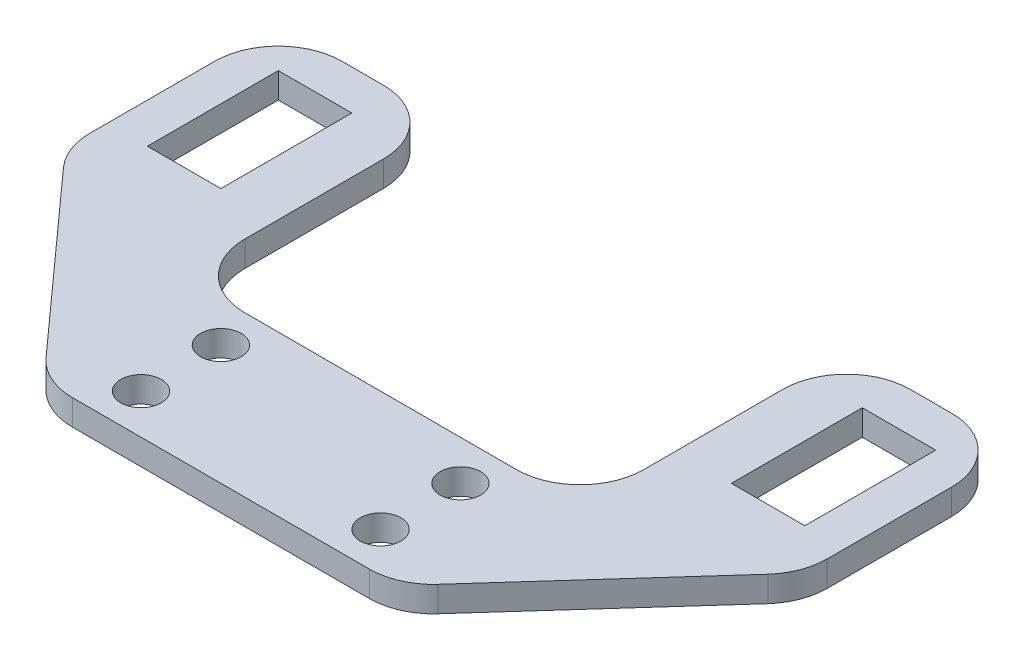
ISO-10303-21;
HEADER;
FILE_DESCRIPTION(('STEP AP214'),'2;1');
FILE_NAME('part.step','',(''),(''),'','','');
FILE_SCHEMA(('AUTOMOTIVE_DESIGN { 1 0 10303 214 1 1 1 1 }'));
ENDSEC;
DATA;
#1=APPLICATION_CONTEXT('core data for automotive mechanical design processes');
#2=APPLICATION_PROTOCOL_DEFINITION('international standard','automotive_design',2000,#1);
#3=PRODUCT_CONTEXT('',#1,'mechanical');
#4=PRODUCT('Part','Part','',(#3));
#5=PRODUCT_RELATED_PRODUCT_CATEGORY('part','',(#4));
#6=PRODUCT_DEFINITION_FORMATION('','',#4);
#7=PRODUCT_DEFINITION_CONTEXT('part definition',#1,'design');
#8=PRODUCT_DEFINITION('design','',#6,#7);
#9=PRODUCT_DEFINITION_SHAPE('','',#8);
#10=(LENGTH_UNIT() NAMED_UNIT(*) SI_UNIT(.MILLI.,.METRE.));
#11=(NAMED_UNIT(*) PLANE_ANGLE_UNIT() SI_UNIT($,.RADIAN.));
#12=(NAMED_UNIT(*) SI_UNIT($,.STERADIAN.) SOLID_ANGLE_UNIT());
#13=UNCERTAINTY_MEASURE_WITH_UNIT(LENGTH_MEASURE(1.E-05),#10,'distance_accuracy_value','');
#14=(GEOMETRIC_REPRESENTATION_CONTEXT(3) GLOBAL_UNCERTAINTY_ASSIGNED_CONTEXT((#13)) GLOBAL_UNIT_ASSIGNED_CONTEXT((#10,
#11,#12)) REPRESENTATION_CONTEXT('',''));
#15=CARTESIAN_POINT('',(0.,0.,0.));
#16=DIRECTION('',(0.,0.,1.));
#17=DIRECTION('',(1.,0.,0.));
#18=AXIS2_PLACEMENT_3D('',#15,#16,#17);
#19=CARTESIAN_POINT('',(0.,2.032,-33.8903073452829));
#20=DIRECTION('',(0.,0.,1.));
#21=DIRECTION('',(1.,0.,0.));
#22=AXIS2_PLACEMENT_3D('',#19,#20,#21);
#23=PLANE('',#22);
#24=DIRECTION('',(-1.,0.,0.));
#25=VECTOR('',#24,1.);
#26=CARTESIAN_POINT('',(0.,2.032,-33.8903073452829));
#27=LINE('',#26,#25);
#28=CARTESIAN_POINT('',(53.556614690566,2.032,-33.8903073452829));
#29=VERTEX_POINT('',#28);
#30=CARTESIAN_POINT('',(50.273307345283,2.032,-33.8903073452829));
#31=VERTEX_POINT('',#30);
#32=EDGE_CURVE('E331',#29,#31,#27,.T.);
#33=ORIENTED_EDGE('',*,*,#32,.F.);
#34=DIRECTION('',(0.,-1.,0.));
#35=VECTOR('',#34,1.);
#36=CARTESIAN_POINT('',(53.556614690566,2.032,-33.8903073452829));
#37=LINE('',#36,#35);
#38=CARTESIAN_POINT('',(53.556614690566,0.,-33.8903073452829));
#39=VERTEX_POINT('',#38);
#40=EDGE_CURVE('E404',#29,#39,#37,.T.);
#41=ORIENTED_EDGE('',*,*,#40,.T.);
#42=DIRECTION('',(-1.,0.,0.));
#43=VECTOR('',#42,1.);
#44=CARTESIAN_POINT('',(0.,0.,-33.8903073452829));
#45=LINE('',#44,#43);
#46=CARTESIAN_POINT('',(50.273307345283,0.,-33.8903073452829));
#47=VERTEX_POINT('',#46);
#48=EDGE_CURVE('E322',#39,#47,#45,.T.);
#49=ORIENTED_EDGE('',*,*,#48,.T.);
#50=DIRECTION('',(0.,1.,0.));
#51=VECTOR('',#50,1.);
#52=CARTESIAN_POINT('',(50.273307345283,2.032,-33.8903073452829));
#53=LINE('',#52,#51);
#54=EDGE_CURVE('E401',#47,#31,#53,.T.);
#55=ORIENTED_EDGE('',*,*,#54,.T.);
#56=EDGE_LOOP('',(#33,#41,#49,#55));
#57=FACE_BOUND('',#56,.T.);
#58=ADVANCED_FACE('F33',(#57),#23,.F.);
#59=CARTESIAN_POINT('',(0.,2.032,0.));
#60=DIRECTION('',(0.,-1.,0.));
#61=DIRECTION('',(0.,0.,-1.));
#62=AXIS2_PLACEMENT_3D('',#59,#60,#61);
#63=PLANE('',#62);
#64=CARTESIAN_POINT('',(38.843307345283,2.032,-9.525));
#65=DIRECTION('',(0.,1.,0.));
#66=DIRECTION('',(0.,0.,-1.));
#67=AXIS2_PLACEMENT_3D('',#64,#65,#66);
#68=CIRCLE('',#67,1.6129);
#69=CARTESIAN_POINT('',(38.843307345283,2.032,-11.1379));
#70=VERTEX_POINT('',#69);
#71=EDGE_CURVE('E263',#70,#70,#68,.T.);
#72=ORIENTED_EDGE('',*,*,#71,.F.);
#73=EDGE_LOOP('',(#72));
#74=FACE_BOUND('',#73,.T.);
#75=CARTESIAN_POINT('',(38.843307345283,2.032,-3.175));
#76=DIRECTION('',(0.,1.,0.));
#77=DIRECTION('',(0.,0.,-1.));
#78=AXIS2_PLACEMENT_3D('',#75,#76,#77);
#79=CIRCLE('',#78,1.6129);
#80=CARTESIAN_POINT('',(38.843307345283,2.032,-4.7879));
#81=VERTEX_POINT('',#80);
#82=EDGE_CURVE('E269',#81,#81,#79,.T.);
#83=ORIENTED_EDGE('',*,*,#82,.F.);
#84=EDGE_LOOP('',(#83));
#85=FACE_BOUND('',#84,.T.);
#86=CARTESIAN_POINT('',(19.793307345283,2.032,-3.175));
#87=DIRECTION('',(0.,1.,0.));
#88=DIRECTION('',(0.,0.,1.));
#89=AXIS2_PLACEMENT_3D('',#86,#87,#88);
#90=CIRCLE('',#89,1.6129);
#91=CARTESIAN_POINT('',(19.793307345283,2.032,-1.5621));
#92=VERTEX_POINT('',#91);
#93=EDGE_CURVE('E275',#92,#92,#90,.T.);
#94=ORIENTED_EDGE('',*,*,#93,.F.);
#95=EDGE_LOOP('',(#94));
#96=FACE_BOUND('',#95,.T.);
#97=CARTESIAN_POINT('',(19.793307345283,2.032,-9.525));
#98=DIRECTION('',(0.,1.,0.));
#99=DIRECTION('',(0.,0.,1.));
#100=AXIS2_PLACEMENT_3D('',#97,#98,#99);
#101=CIRCLE('',#100,1.6129);
#102=CARTESIAN_POINT('',(19.793307345283,2.032,-7.9121));
#103=VERTEX_POINT('',#102);
#104=EDGE_CURVE('E281',#103,#103,#101,.T.);
#105=ORIENTED_EDGE('',*,*,#104,.F.);
#106=EDGE_LOOP('',(#105));
#107=FACE_BOUND('',#106,.T.);
#108=DIRECTION('',(0.,0.,1.));
#109=VECTOR('',#108,1.);
#110=CARTESIAN_POINT('',(3.17499999999999,2.032,-30.715307345283));
#111=LINE('',#110,#109);
#112=CARTESIAN_POINT('',(3.17499999999999,2.032,-30.715307345283));
#113=VERTEX_POINT('',#112);
#114=CARTESIAN_POINT('',(3.17499999999999,2.032,-20.301307345283));
#115=VERTEX_POINT('',#114);
#116=EDGE_CURVE('E287',#113,#115,#111,.T.);
#117=ORIENTED_EDGE('',*,*,#116,.F.);
#118=DIRECTION('',(-1.,0.,0.));
#119=VECTOR('',#118,1.);
#120=CARTESIAN_POINT('',(3.17499999999999,2.032,-30.715307345283));
#121=LINE('',#120,#119);
#122=CARTESIAN_POINT('',(9.01699999999999,2.032,-30.715307345283));
#123=VERTEX_POINT('',#122);
#124=EDGE_CURVE('E295',#123,#113,#121,.T.);
#125=ORIENTED_EDGE('',*,*,#124,.F.);
#126=DIRECTION('',(0.,0.,-1.));
#127=VECTOR('',#126,1.);
#128=CARTESIAN_POINT('',(9.01699999999999,2.032,-30.715307345283));
#129=LINE('',#128,#127);
#130=CARTESIAN_POINT('',(9.01699999999999,2.032,-20.301307345283));
#131=VERTEX_POINT('',#130);
#132=EDGE_CURVE('E292',#131,#123,#129,.T.);
#133=ORIENTED_EDGE('',*,*,#132,.F.);
#134=DIRECTION('',(1.,0.,0.));
#135=VECTOR('',#134,1.);
#136=CARTESIAN_POINT('',(3.17499999999999,2.032,-20.301307345283));
#137=LINE('',#136,#135);
#138=EDGE_CURVE('E289',#115,#131,#137,.T.);
#139=ORIENTED_EDGE('',*,*,#138,.F.);
#140=EDGE_LOOP('',(#117,#125,#133,#139));
#141=FACE_BOUND('',#140,.T.);
#142=DIRECTION('',(1.,0.,0.));
#143=VECTOR('',#142,1.);
#144=CARTESIAN_POINT('',(0.,2.032,0.));
#145=LINE('',#144,#143);
#146=CARTESIAN_POINT('',(17.5034971864712,2.032,0.));
#147=VERTEX_POINT('',#146);
#148=CARTESIAN_POINT('',(41.1331175040948,2.032,0.));
#149=VERTEX_POINT('',#148);
#150=EDGE_CURVE('E321',#147,#149,#145,.T.);
#151=ORIENTED_EDGE('',*,*,#150,.T.);
#152=CARTESIAN_POINT('',(41.1331175040948,2.032,-5.07999999999999));
#153=DIRECTION('',(0.,-1.,0.));
#154=DIRECTION('',(0.,0.,-1.));
#155=AXIS2_PLACEMENT_3D('',#152,#153,#154);
#156=CIRCLE('',#155,5.08);
#157=CARTESIAN_POINT('',(44.9102306403736,2.032,-1.68296947971463));
#158=VERTEX_POINT('',#157);
#159=EDGE_CURVE('E361',#149,#158,#156,.F.);
#160=ORIENTED_EDGE('',*,*,#159,.T.);
#161=DIRECTION('',(-0.668706795331764,0.,0.743526207928895));
#162=VECTOR('',#161,1.);
#163=CARTESIAN_POINT('',(58.636614690566,2.032,-16.9451536726415));
#164=LINE('',#163,#162);
#165=CARTESIAN_POINT('',(57.3337278268448,2.032,-15.4964910660915));
#166=VERTEX_POINT('',#165);
#167=EDGE_CURVE('E483',#166,#158,#164,.T.);
#168=ORIENTED_EDGE('',*,*,#167,.F.);
#169=CARTESIAN_POINT('',(53.556614690566,2.032,-18.8935215863769));
#170=DIRECTION('',(0.,-1.,0.));
#171=DIRECTION('',(0.,0.,-1.));
#172=AXIS2_PLACEMENT_3D('',#169,#170,#171);
#173=CIRCLE('',#172,5.08);
#174=CARTESIAN_POINT('',(58.636614690566,2.032,-18.8935215863769));
#175=VERTEX_POINT('',#174);
#176=EDGE_CURVE('E355',#166,#175,#173,.F.);
#177=ORIENTED_EDGE('',*,*,#176,.T.);
#178=DIRECTION('',(0.,0.,-1.));
#179=VECTOR('',#178,1.);
#180=CARTESIAN_POINT('',(58.636614690566,2.032,0.));
#181=LINE('',#180,#179);
#182=CARTESIAN_POINT('',(58.636614690566,2.032,-28.8103073452829));
#183=VERTEX_POINT('',#182);
#184=EDGE_CURVE('E325',#175,#183,#181,.T.);
#185=ORIENTED_EDGE('',*,*,#184,.T.);
#186=CARTESIAN_POINT('',(53.556614690566,2.032,-28.8103073452829));
#187=DIRECTION('',(0.,-1.,0.));
#188=DIRECTION('',(0.,0.,-1.));
#189=AXIS2_PLACEMENT_3D('',#186,#187,#188);
#190=CIRCLE('',#189,5.08);
#191=EDGE_CURVE('E351',#183,#29,#190,.F.);
#192=ORIENTED_EDGE('',*,*,#191,.T.);
#193=ORIENTED_EDGE('',*,*,#32,.T.);
#194=CARTESIAN_POINT('',(50.273307345283,2.032,-28.8103073452829));
#195=DIRECTION('',(0.,-1.,0.));
#196=DIRECTION('',(0.,0.,-1.));
#197=AXIS2_PLACEMENT_3D('',#194,#195,#196);
#198=CIRCLE('',#197,5.08);
#199=CARTESIAN_POINT('',(45.193307345283,2.032,-28.8103073452829));
#200=VERTEX_POINT('',#199);
#201=EDGE_CURVE('E347',#31,#200,#198,.F.);
#202=ORIENTED_EDGE('',*,*,#201,.T.);
#203=DIRECTION('',(0.,0.,-1.));
#204=VECTOR('',#203,1.);
#205=CARTESIAN_POINT('',(45.193307345283,2.032,-12.7));
#206=LINE('',#205,#204);
#207=CARTESIAN_POINT('',(45.193307345283,2.032,-17.78));
#208=VERTEX_POINT('',#207);
#209=EDGE_CURVE('E457',#208,#200,#206,.T.);
#210=ORIENTED_EDGE('',*,*,#209,.F.);
#211=CARTESIAN_POINT('',(40.113307345283,2.032,-17.78));
#212=DIRECTION('',(0.,-1.,0.));
#213=DIRECTION('',(0.,0.,-1.));
#214=AXIS2_PLACEMENT_3D('',#211,#212,#213);
#215=CIRCLE('',#214,5.08);
#216=CARTESIAN_POINT('',(40.113307345283,2.032,-12.7));
#217=VERTEX_POINT('',#216);
#218=EDGE_CURVE('E422',#208,#217,#215,.T.);
#219=ORIENTED_EDGE('',*,*,#218,.T.);
#220=DIRECTION('',(1.,0.,0.));
#221=VECTOR('',#220,1.);
#222=CARTESIAN_POINT('',(13.443307345283,2.032,-12.7));
#223=LINE('',#222,#221);
#224=CARTESIAN_POINT('',(18.523307345283,2.032,-12.7));
#225=VERTEX_POINT('',#224);
#226=EDGE_CURVE('E431',#225,#217,#223,.T.);
#227=ORIENTED_EDGE('',*,*,#226,.F.);
#228=CARTESIAN_POINT('',(18.523307345283,2.032,-17.78));
#229=DIRECTION('',(0.,-1.,0.));
#230=DIRECTION('',(0.,0.,-1.));
#231=AXIS2_PLACEMENT_3D('',#228,#229,#230);
#232=CIRCLE('',#231,5.08);
#233=CARTESIAN_POINT('',(13.443307345283,2.032,-17.78));
#234=VERTEX_POINT('',#233);
#235=EDGE_CURVE('E41',#225,#234,#232,.T.);
#236=ORIENTED_EDGE('',*,*,#235,.T.);
#237=DIRECTION('',(0.,0.,1.));
#238=VECTOR('',#237,1.);
#239=CARTESIAN_POINT('',(13.443307345283,2.032,-33.8903073452829));
#240=LINE('',#239,#238);
#241=CARTESIAN_POINT('',(13.443307345283,2.032,-28.8103073452829));
#242=VERTEX_POINT('',#241);
#243=EDGE_CURVE('E429',#242,#234,#240,.T.);
#244=ORIENTED_EDGE('',*,*,#243,.F.);
#245=CARTESIAN_POINT('',(8.363307345283,2.032,-28.8103073452829));
#246=DIRECTION('',(0.,-1.,0.));
#247=DIRECTION('',(0.,0.,-1.));
#248=AXIS2_PLACEMENT_3D('',#245,#246,#247);
#249=CIRCLE('',#248,5.08);
#250=CARTESIAN_POINT('',(8.363307345283,2.032,-33.8903073452829));
#251=VERTEX_POINT('',#250);
#252=EDGE_CURVE('E349',#242,#251,#249,.F.);
#253=ORIENTED_EDGE('',*,*,#252,.T.);
#254=CARTESIAN_POINT('',(5.08,2.032,-33.8903073452829));
#255=VERTEX_POINT('',#254);
#256=EDGE_CURVE('E328',#251,#255,#27,.T.);
#257=ORIENTED_EDGE('',*,*,#256,.T.);
#258=CARTESIAN_POINT('',(5.08,2.032,-28.8103073452829));
#259=DIRECTION('',(0.,-1.,0.));
#260=DIRECTION('',(0.,0.,-1.));
#261=AXIS2_PLACEMENT_3D('',#258,#259,#260);
#262=CIRCLE('',#261,5.08);
#263=CARTESIAN_POINT('',(0.,2.032,-28.8103073452829));
#264=VERTEX_POINT('',#263);
#265=EDGE_CURVE('E353',#255,#264,#262,.F.);
#266=ORIENTED_EDGE('',*,*,#265,.T.);
#267=DIRECTION('',(0.,0.,1.));
#268=VECTOR('',#267,1.);
#269=CARTESIAN_POINT('',(0.,2.032,0.));
#270=LINE('',#269,#268);
#271=CARTESIAN_POINT('',(0.,2.032,-18.8935215863768));
#272=VERTEX_POINT('',#271);
#273=EDGE_CURVE('E318',#264,#272,#270,.T.);
#274=ORIENTED_EDGE('',*,*,#273,.T.);
#275=CARTESIAN_POINT('',(5.08,2.032,-18.8935215863768));
#276=DIRECTION('',(0.,-1.,0.));
#277=DIRECTION('',(0.,0.,-1.));
#278=AXIS2_PLACEMENT_3D('',#275,#276,#277);
#279=CIRCLE('',#278,5.08);
#280=CARTESIAN_POINT('',(1.30288686372122,2.032,-15.4964910660915));
#281=VERTEX_POINT('',#280);
#282=EDGE_CURVE('E357',#272,#281,#279,.F.);
#283=ORIENTED_EDGE('',*,*,#282,.T.);
#284=DIRECTION('',(-0.668706795331764,0.,-0.743526207928895));
#285=VECTOR('',#284,1.);
#286=CARTESIAN_POINT('',(0.,2.032,-16.9451536726415));
#287=LINE('',#286,#285);
#288=CARTESIAN_POINT('',(13.7263840501924,2.032,-1.68296947971464));
#289=VERTEX_POINT('',#288);
#290=EDGE_CURVE('E494',#289,#281,#287,.T.);
#291=ORIENTED_EDGE('',*,*,#290,.F.);
#292=CARTESIAN_POINT('',(17.5034971864712,2.032,-5.08));
#293=DIRECTION('',(0.,-1.,0.));
#294=DIRECTION('',(0.,0.,-1.));
#295=AXIS2_PLACEMENT_3D('',#292,#293,#294);
#296=CIRCLE('',#295,5.08);
#297=EDGE_CURVE('E359',#289,#147,#296,.F.);
#298=ORIENTED_EDGE('',*,*,#297,.T.);
#299=EDGE_LOOP('',(#151,#160,#168,#177,#185,#192,#193,#202,#210,#219,#227,#236,#244,#253,#257,
#266,#274,#283,#291,#298));
#300=FACE_BOUND('',#299,.T.);
#301=DIRECTION('',(0.,0.,-1.));
#302=VECTOR('',#301,1.);
#303=CARTESIAN_POINT('',(55.461614690566,2.032,-30.715307345283));
#304=LINE('',#303,#302);
#305=CARTESIAN_POINT('',(55.461614690566,2.032,-20.301307345283));
#306=VERTEX_POINT('',#305);
#307=CARTESIAN_POINT('',(55.461614690566,2.032,-30.715307345283));
#308=VERTEX_POINT('',#307);
#309=EDGE_CURVE('E219',#306,#308,#304,.T.);
#310=ORIENTED_EDGE('',*,*,#309,.F.);
#311=DIRECTION('',(1.,0.,0.));
#312=VECTOR('',#311,1.);
#313=CARTESIAN_POINT('',(55.461614690566,2.032,-20.301307345283));
#314=LINE('',#313,#312);
#315=CARTESIAN_POINT('',(49.619614690566,2.032,-20.301307345283));
#316=VERTEX_POINT('',#315);
#317=EDGE_CURVE('E245',#316,#306,#314,.T.);
#318=ORIENTED_EDGE('',*,*,#317,.F.);
#319=DIRECTION('',(0.,0.,1.));
#320=VECTOR('',#319,1.);
#321=CARTESIAN_POINT('',(49.619614690566,2.032,-30.715307345283));
#322=LINE('',#321,#320);
#323=CARTESIAN_POINT('',(49.619614690566,2.032,-30.715307345283));
#324=VERTEX_POINT('',#323);
#325=EDGE_CURVE('E243',#324,#316,#322,.T.);
#326=ORIENTED_EDGE('',*,*,#325,.F.);
#327=DIRECTION('',(-1.,0.,0.));
#328=VECTOR('',#327,1.);
#329=CARTESIAN_POINT('',(55.461614690566,2.032,-30.715307345283));
#330=LINE('',#329,#328);
#331=EDGE_CURVE('E229',#308,#324,#330,.T.);
#332=ORIENTED_EDGE('',*,*,#331,.F.);
#333=EDGE_LOOP('',(#310,#318,#326,#332));
#334=FACE_BOUND('',#333,.T.);
#335=ADVANCED_FACE('F241',(#74,#85,#96,#107,#141,#300,#334),#63,.F.);
#336=CARTESIAN_POINT('',(0.,0.,0.));
#337=DIRECTION('',(0.,-1.,0.));
#338=DIRECTION('',(0.,0.,-1.));
#339=AXIS2_PLACEMENT_3D('',#336,#337,#338);
#340=PLANE('',#339);
#341=DIRECTION('',(-0.668706795331764,0.,0.743526207928895));
#342=VECTOR('',#341,1.);
#343=CARTESIAN_POINT('',(58.636614690566,0.,-16.9451536726415));
#344=LINE('',#343,#342);
#345=CARTESIAN_POINT('',(57.3337278268448,0.,-15.4964910660915));
#346=VERTEX_POINT('',#345);
#347=CARTESIAN_POINT('',(44.9102306403736,0.,-1.68296947971463));
#348=VERTEX_POINT('',#347);
#349=EDGE_CURVE('E492',#346,#348,#344,.T.);
#350=ORIENTED_EDGE('',*,*,#349,.T.);
#351=CARTESIAN_POINT('',(41.1331175040948,0.,-5.07999999999999));
#352=DIRECTION('',(0.,-1.,0.));
#353=DIRECTION('',(0.,0.,-1.));
#354=AXIS2_PLACEMENT_3D('',#351,#352,#353);
#355=CIRCLE('',#354,5.08);
#356=CARTESIAN_POINT('',(41.1331175040948,0.,0.));
#357=VERTEX_POINT('',#356);
#358=EDGE_CURVE('E381',#348,#357,#355,.T.);
#359=ORIENTED_EDGE('',*,*,#358,.T.);
#360=DIRECTION('',(1.,0.,0.));
#361=VECTOR('',#360,1.);
#362=CARTESIAN_POINT('',(0.,0.,0.));
#363=LINE('',#362,#361);
#364=CARTESIAN_POINT('',(17.5034971864712,0.,0.));
#365=VERTEX_POINT('',#364);
#366=EDGE_CURVE('E334',#365,#357,#363,.T.);
#367=ORIENTED_EDGE('',*,*,#366,.F.);
#368=CARTESIAN_POINT('',(17.5034971864712,0.,-5.08));
#369=DIRECTION('',(0.,-1.,0.));
#370=DIRECTION('',(0.,0.,-1.));
#371=AXIS2_PLACEMENT_3D('',#368,#369,#370);
#372=CIRCLE('',#371,5.08);
#373=CARTESIAN_POINT('',(13.7263840501924,0.,-1.68296947971464));
#374=VERTEX_POINT('',#373);
#375=EDGE_CURVE('E379',#365,#374,#372,.T.);
#376=ORIENTED_EDGE('',*,*,#375,.T.);
#377=DIRECTION('',(-0.668706795331764,0.,-0.743526207928895));
#378=VECTOR('',#377,1.);
#379=CARTESIAN_POINT('',(0.,0.,-16.9451536726415));
#380=LINE('',#379,#378);
#381=CARTESIAN_POINT('',(1.30288686372122,0.,-15.4964910660915));
#382=VERTEX_POINT('',#381);
#383=EDGE_CURVE('E440',#374,#382,#380,.T.);
#384=ORIENTED_EDGE('',*,*,#383,.T.);
#385=CARTESIAN_POINT('',(5.08,0.,-18.8935215863768));
#386=DIRECTION('',(0.,-1.,0.));
#387=DIRECTION('',(0.,0.,-1.));
#388=AXIS2_PLACEMENT_3D('',#385,#386,#387);
#389=CIRCLE('',#388,5.08);
#390=CARTESIAN_POINT('',(0.,0.,-18.8935215863768));
#391=VERTEX_POINT('',#390);
#392=EDGE_CURVE('E377',#382,#391,#389,.T.);
#393=ORIENTED_EDGE('',*,*,#392,.T.);
#394=DIRECTION('',(0.,0.,1.));
#395=VECTOR('',#394,1.);
#396=CARTESIAN_POINT('',(0.,0.,0.));
#397=LINE('',#396,#395);
#398=CARTESIAN_POINT('',(0.,0.,-28.8103073452829));
#399=VERTEX_POINT('',#398);
#400=EDGE_CURVE('E317',#399,#391,#397,.T.);
#401=ORIENTED_EDGE('',*,*,#400,.F.);
#402=CARTESIAN_POINT('',(5.08,0.,-28.8103073452829));
#403=DIRECTION('',(0.,-1.,0.));
#404=DIRECTION('',(0.,0.,-1.));
#405=AXIS2_PLACEMENT_3D('',#402,#403,#404);
#406=CIRCLE('',#405,5.08);
#407=CARTESIAN_POINT('',(5.08,0.,-33.8903073452829));
#408=VERTEX_POINT('',#407);
#409=EDGE_CURVE('E373',#399,#408,#406,.T.);
#410=ORIENTED_EDGE('',*,*,#409,.T.);
#411=CARTESIAN_POINT('',(8.363307345283,0.,-33.8903073452829));
#412=VERTEX_POINT('',#411);
#413=EDGE_CURVE('E339',#412,#408,#45,.T.);
#414=ORIENTED_EDGE('',*,*,#413,.F.);
#415=CARTESIAN_POINT('',(8.363307345283,0.,-28.8103073452829));
#416=DIRECTION('',(0.,-1.,0.));
#417=DIRECTION('',(0.,0.,-1.));
#418=AXIS2_PLACEMENT_3D('',#415,#416,#417);
#419=CIRCLE('',#418,5.08);
#420=CARTESIAN_POINT('',(13.443307345283,0.,-28.8103073452829));
#421=VERTEX_POINT('',#420);
#422=EDGE_CURVE('E370',#412,#421,#419,.T.);
#423=ORIENTED_EDGE('',*,*,#422,.T.);
#424=DIRECTION('',(0.,0.,1.));
#425=VECTOR('',#424,1.);
#426=CARTESIAN_POINT('',(13.443307345283,0.,-33.8903073452829));
#427=LINE('',#426,#425);
#428=CARTESIAN_POINT('',(13.443307345283,0.,-17.78));
#429=VERTEX_POINT('',#428);
#430=EDGE_CURVE('E450',#421,#429,#427,.T.);
#431=ORIENTED_EDGE('',*,*,#430,.T.);
#432=CARTESIAN_POINT('',(18.523307345283,0.,-17.78));
#433=DIRECTION('',(0.,-1.,0.));
#434=DIRECTION('',(0.,0.,-1.));
#435=AXIS2_PLACEMENT_3D('',#432,#433,#434);
#436=CIRCLE('',#435,5.08);
#437=CARTESIAN_POINT('',(18.523307345283,0.,-12.7));
#438=VERTEX_POINT('',#437);
#439=EDGE_CURVE('E11',#429,#438,#436,.F.);
#440=ORIENTED_EDGE('',*,*,#439,.T.);
#441=DIRECTION('',(1.,0.,0.));
#442=VECTOR('',#441,1.);
#443=CARTESIAN_POINT('',(13.443307345283,0.,-12.7));
#444=LINE('',#443,#442);
#445=CARTESIAN_POINT('',(40.113307345283,0.,-12.7));
#446=VERTEX_POINT('',#445);
#447=EDGE_CURVE('E448',#438,#446,#444,.T.);
#448=ORIENTED_EDGE('',*,*,#447,.T.);
#449=CARTESIAN_POINT('',(40.113307345283,0.,-17.78));
#450=DIRECTION('',(0.,-1.,0.));
#451=DIRECTION('',(0.,0.,-1.));
#452=AXIS2_PLACEMENT_3D('',#449,#450,#451);
#453=CIRCLE('',#452,5.08);
#454=CARTESIAN_POINT('',(45.193307345283,0.,-17.78));
#455=VERTEX_POINT('',#454);
#456=EDGE_CURVE('E424',#446,#455,#453,.F.);
#457=ORIENTED_EDGE('',*,*,#456,.T.);
#458=DIRECTION('',(0.,0.,-1.));
#459=VECTOR('',#458,1.);
#460=CARTESIAN_POINT('',(45.193307345283,0.,-12.7));
#461=LINE('',#460,#459);
#462=CARTESIAN_POINT('',(45.193307345283,0.,-28.8103073452829));
#463=VERTEX_POINT('',#462);
#464=EDGE_CURVE('E252',#455,#463,#461,.T.);
#465=ORIENTED_EDGE('',*,*,#464,.T.);
#466=CARTESIAN_POINT('',(50.273307345283,0.,-28.8103073452829));
#467=DIRECTION('',(0.,-1.,0.));
#468=DIRECTION('',(0.,0.,-1.));
#469=AXIS2_PLACEMENT_3D('',#466,#467,#468);
#470=CIRCLE('',#469,5.08);
#471=EDGE_CURVE('E368',#463,#47,#470,.T.);
#472=ORIENTED_EDGE('',*,*,#471,.T.);
#473=ORIENTED_EDGE('',*,*,#48,.F.);
#474=CARTESIAN_POINT('',(53.556614690566,0.,-28.8103073452829));
#475=DIRECTION('',(0.,-1.,0.));
#476=DIRECTION('',(0.,0.,-1.));
#477=AXIS2_PLACEMENT_3D('',#474,#475,#476);
#478=CIRCLE('',#477,5.08);
#479=CARTESIAN_POINT('',(58.636614690566,0.,-28.8103073452829));
#480=VERTEX_POINT('',#479);
#481=EDGE_CURVE('E48',#39,#480,#478,.T.);
#482=ORIENTED_EDGE('',*,*,#481,.T.);
#483=DIRECTION('',(0.,0.,-1.));
#484=VECTOR('',#483,1.);
#485=CARTESIAN_POINT('',(58.636614690566,0.,0.));
#486=LINE('',#485,#484);
#487=CARTESIAN_POINT('',(58.636614690566,0.,-18.8935215863769));
#488=VERTEX_POINT('',#487);
#489=EDGE_CURVE('E337',#488,#480,#486,.T.);
#490=ORIENTED_EDGE('',*,*,#489,.F.);
#491=CARTESIAN_POINT('',(53.556614690566,0.,-18.8935215863769));
#492=DIRECTION('',(0.,-1.,0.));
#493=DIRECTION('',(0.,0.,-1.));
#494=AXIS2_PLACEMENT_3D('',#491,#492,#493);
#495=CIRCLE('',#494,5.08);
#496=EDGE_CURVE('E375',#488,#346,#495,.T.);
#497=ORIENTED_EDGE('',*,*,#496,.T.);
#498=EDGE_LOOP('',(#350,#359,#367,#376,#384,#393,#401,#410,#414,#423,#431,#440,#448,#457,#465,
#472,#473,#482,#490,#497));
#499=FACE_BOUND('',#498,.T.);
#500=CARTESIAN_POINT('',(38.843307345283,0.,-3.175));
#501=DIRECTION('',(0.,1.,0.));
#502=DIRECTION('',(0.,0.,-1.));
#503=AXIS2_PLACEMENT_3D('',#500,#501,#502);
#504=CIRCLE('',#503,1.6129);
#505=CARTESIAN_POINT('',(38.843307345283,0.,-4.7879));
#506=VERTEX_POINT('',#505);
#507=EDGE_CURVE('E266',#506,#506,#504,.T.);
#508=ORIENTED_EDGE('',*,*,#507,.T.);
#509=EDGE_LOOP('',(#508));
#510=FACE_BOUND('',#509,.T.);
#511=CARTESIAN_POINT('',(19.793307345283,0.,-9.525));
#512=DIRECTION('',(0.,1.,0.));
#513=DIRECTION('',(0.,0.,1.));
#514=AXIS2_PLACEMENT_3D('',#511,#512,#513);
#515=CIRCLE('',#514,1.6129);
#516=CARTESIAN_POINT('',(19.793307345283,0.,-7.9121));
#517=VERTEX_POINT('',#516);
#518=EDGE_CURVE('E278',#517,#517,#515,.T.);
#519=ORIENTED_EDGE('',*,*,#518,.T.);
#520=EDGE_LOOP('',(#519));
#521=FACE_BOUND('',#520,.T.);
#522=DIRECTION('',(-1.,0.,0.));
#523=VECTOR('',#522,1.);
#524=CARTESIAN_POINT('',(3.17499999999999,0.,-30.715307345283));
#525=LINE('',#524,#523);
#526=CARTESIAN_POINT('',(9.01699999999999,0.,-30.715307345283));
#527=VERTEX_POINT('',#526);
#528=CARTESIAN_POINT('',(3.17499999999999,0.,-30.715307345283));
#529=VERTEX_POINT('',#528);
#530=EDGE_CURVE('E290',#527,#529,#525,.T.);
#531=ORIENTED_EDGE('',*,*,#530,.T.);
#532=DIRECTION('',(0.,0.,1.));
#533=VECTOR('',#532,1.);
#534=CARTESIAN_POINT('',(3.17499999999999,0.,-30.715307345283));
#535=LINE('',#534,#533);
#536=CARTESIAN_POINT('',(3.17499999999999,0.,-20.301307345283));
#537=VERTEX_POINT('',#536);
#538=EDGE_CURVE('E284',#529,#537,#535,.T.);
#539=ORIENTED_EDGE('',*,*,#538,.T.);
#540=DIRECTION('',(1.,0.,0.));
#541=VECTOR('',#540,1.);
#542=CARTESIAN_POINT('',(3.17499999999999,0.,-20.301307345283));
#543=LINE('',#542,#541);
#544=CARTESIAN_POINT('',(9.01699999999999,0.,-20.301307345283));
#545=VERTEX_POINT('',#544);
#546=EDGE_CURVE('E300',#537,#545,#543,.T.);
#547=ORIENTED_EDGE('',*,*,#546,.T.);
#548=DIRECTION('',(0.,0.,-1.));
#549=VECTOR('',#548,1.);
#550=CARTESIAN_POINT('',(9.01699999999999,0.,-30.715307345283));
#551=LINE('',#550,#549);
#552=EDGE_CURVE('E303',#545,#527,#551,.T.);
#553=ORIENTED_EDGE('',*,*,#552,.T.);
#554=EDGE_LOOP('',(#531,#539,#547,#553));
#555=FACE_BOUND('',#554,.T.);
#556=CARTESIAN_POINT('',(19.793307345283,0.,-3.175));
#557=DIRECTION('',(0.,1.,0.));
#558=DIRECTION('',(0.,0.,1.));
#559=AXIS2_PLACEMENT_3D('',#556,#557,#558);
#560=CIRCLE('',#559,1.6129);
#561=CARTESIAN_POINT('',(19.793307345283,0.,-1.5621));
#562=VERTEX_POINT('',#561);
#563=EDGE_CURVE('E272',#562,#562,#560,.T.);
#564=ORIENTED_EDGE('',*,*,#563,.T.);
#565=EDGE_LOOP('',(#564));
#566=FACE_BOUND('',#565,.T.);
#567=CARTESIAN_POINT('',(38.843307345283,0.,-9.525));
#568=DIRECTION('',(0.,1.,0.));
#569=DIRECTION('',(0.,0.,-1.));
#570=AXIS2_PLACEMENT_3D('',#567,#568,#569);
#571=CIRCLE('',#570,1.6129);
#572=CARTESIAN_POINT('',(38.843307345283,0.,-11.1379));
#573=VERTEX_POINT('',#572);
#574=EDGE_CURVE('E237',#573,#573,#571,.T.);
#575=ORIENTED_EDGE('',*,*,#574,.T.);
#576=EDGE_LOOP('',(#575));
#577=FACE_BOUND('',#576,.T.);
#578=DIRECTION('',(1.,0.,0.));
#579=VECTOR('',#578,1.);
#580=CARTESIAN_POINT('',(55.461614690566,0.,-20.301307345283));
#581=LINE('',#580,#579);
#582=CARTESIAN_POINT('',(49.619614690566,0.,-20.301307345283));
#583=VERTEX_POINT('',#582);
#584=CARTESIAN_POINT('',(55.461614690566,0.,-20.301307345283));
#585=VERTEX_POINT('',#584);
#586=EDGE_CURVE('E230',#583,#585,#581,.T.);
#587=ORIENTED_EDGE('',*,*,#586,.T.);
#588=DIRECTION('',(0.,0.,-1.));
#589=VECTOR('',#588,1.);
#590=CARTESIAN_POINT('',(55.461614690566,0.,-30.715307345283));
#591=LINE('',#590,#589);
#592=CARTESIAN_POINT('',(55.461614690566,0.,-30.715307345283));
#593=VERTEX_POINT('',#592);
#594=EDGE_CURVE('E250',#585,#593,#591,.T.);
#595=ORIENTED_EDGE('',*,*,#594,.T.);
#596=DIRECTION('',(-1.,0.,0.));
#597=VECTOR('',#596,1.);
#598=CARTESIAN_POINT('',(55.461614690566,0.,-30.715307345283));
#599=LINE('',#598,#597);
#600=CARTESIAN_POINT('',(49.619614690566,0.,-30.715307345283));
#601=VERTEX_POINT('',#600);
#602=EDGE_CURVE('E236',#593,#601,#599,.T.);
#603=ORIENTED_EDGE('',*,*,#602,.T.);
#604=DIRECTION('',(0.,0.,1.));
#605=VECTOR('',#604,1.);
#606=CARTESIAN_POINT('',(49.619614690566,0.,-30.715307345283));
#607=LINE('',#606,#605);
#608=EDGE_CURVE('E254',#601,#583,#607,.T.);
#609=ORIENTED_EDGE('',*,*,#608,.T.);
#610=EDGE_LOOP('',(#587,#595,#603,#609));
#611=FACE_BOUND('',#610,.T.);
#612=ADVANCED_FACE('F446',(#499,#510,#521,#555,#566,#577,#611),#340,.T.);
#613=CARTESIAN_POINT('',(0.,2.032,0.));
#614=DIRECTION('',(1.,0.,0.));
#615=DIRECTION('',(0.,0.,-1.));
#616=AXIS2_PLACEMENT_3D('',#613,#614,#615);
#617=PLANE('',#616);
#618=ORIENTED_EDGE('',*,*,#400,.T.);
#619=DIRECTION('',(0.,1.,0.));
#620=VECTOR('',#619,1.);
#621=CARTESIAN_POINT('',(0.,2.032,-18.8935215863768));
#622=LINE('',#621,#620);
#623=EDGE_CURVE('E391',#391,#272,#622,.T.);
#624=ORIENTED_EDGE('',*,*,#623,.T.);
#625=ORIENTED_EDGE('',*,*,#273,.F.);
#626=DIRECTION('',(0.,-1.,0.));
#627=VECTOR('',#626,1.);
#628=CARTESIAN_POINT('',(0.,2.032,-28.8103073452829));
#629=LINE('',#628,#627);
#630=EDGE_CURVE('E388',#264,#399,#629,.T.);
#631=ORIENTED_EDGE('',*,*,#630,.T.);
#632=EDGE_LOOP('',(#618,#624,#625,#631));
#633=FACE_BOUND('',#632,.T.);
#634=ADVANCED_FACE('F513',(#633),#617,.F.);
#635=CARTESIAN_POINT('',(0.,2.032,0.));
#636=DIRECTION('',(0.,0.,-1.));
#637=DIRECTION('',(-1.,0.,0.));
#638=AXIS2_PLACEMENT_3D('',#635,#636,#637);
#639=PLANE('',#638);
#640=ORIENTED_EDGE('',*,*,#366,.T.);
#641=DIRECTION('',(0.,1.,0.));
#642=VECTOR('',#641,1.);
#643=CARTESIAN_POINT('',(41.1331175040948,2.032,0.));
#644=LINE('',#643,#642);
#645=EDGE_CURVE('E344',#357,#149,#644,.T.);
#646=ORIENTED_EDGE('',*,*,#645,.T.);
#647=ORIENTED_EDGE('',*,*,#150,.F.);
#648=DIRECTION('',(0.,1.,0.));
#649=VECTOR('',#648,1.);
#650=CARTESIAN_POINT('',(17.5034971864712,2.032,0.));
#651=LINE('',#650,#649);
#652=EDGE_CURVE('E342',#147,#365,#651,.F.);
#653=ORIENTED_EDGE('',*,*,#652,.T.);
#654=EDGE_LOOP('',(#640,#646,#647,#653));
#655=FACE_BOUND('',#654,.T.);
#656=ADVANCED_FACE('F556',(#655),#639,.F.);
#657=CARTESIAN_POINT('',(58.636614690566,2.032,0.));
#658=DIRECTION('',(-1.,0.,0.));
#659=DIRECTION('',(0.,0.,1.));
#660=AXIS2_PLACEMENT_3D('',#657,#658,#659);
#661=PLANE('',#660);
#662=ORIENTED_EDGE('',*,*,#184,.F.);
#663=DIRECTION('',(0.,1.,0.));
#664=VECTOR('',#663,1.);
#665=CARTESIAN_POINT('',(58.636614690566,2.032,-18.8935215863769));
#666=LINE('',#665,#664);
#667=EDGE_CURVE('E55',#175,#488,#666,.F.);
#668=ORIENTED_EDGE('',*,*,#667,.T.);
#669=ORIENTED_EDGE('',*,*,#489,.T.);
#670=DIRECTION('',(0.,-1.,0.));
#671=VECTOR('',#670,1.);
#672=CARTESIAN_POINT('',(58.636614690566,2.032,-28.8103073452829));
#673=LINE('',#672,#671);
#674=EDGE_CURVE('E394',#480,#183,#673,.F.);
#675=ORIENTED_EDGE('',*,*,#674,.T.);
#676=EDGE_LOOP('',(#662,#668,#669,#675));
#677=FACE_BOUND('',#676,.T.);
#678=ADVANCED_FACE('F480',(#677),#661,.F.);
#679=ORIENTED_EDGE('',*,*,#413,.T.);
#680=DIRECTION('',(0.,-1.,0.));
#681=VECTOR('',#680,1.);
#682=CARTESIAN_POINT('',(5.08,2.032,-33.8903073452829));
#683=LINE('',#682,#681);
#684=EDGE_CURVE('E399',#408,#255,#683,.F.);
#685=ORIENTED_EDGE('',*,*,#684,.T.);
#686=ORIENTED_EDGE('',*,*,#256,.F.);
#687=DIRECTION('',(0.,1.,0.));
#688=VECTOR('',#687,1.);
#689=CARTESIAN_POINT('',(8.363307345283,2.032,-33.8903073452829));
#690=LINE('',#689,#688);
#691=EDGE_CURVE('E397',#251,#412,#690,.F.);
#692=ORIENTED_EDGE('',*,*,#691,.T.);
#693=EDGE_LOOP('',(#679,#685,#686,#692));
#694=FACE_BOUND('',#693,.T.);
#695=ADVANCED_FACE('F525',(#694),#23,.F.);
#696=CARTESIAN_POINT('',(3.17499999999999,2.032,-30.715307345283));
#697=DIRECTION('',(1.,0.,0.));
#698=DIRECTION('',(0.,0.,-1.));
#699=AXIS2_PLACEMENT_3D('',#696,#697,#698);
#700=PLANE('',#699);
#701=ORIENTED_EDGE('',*,*,#538,.F.);
#702=DIRECTION('',(0.,-1.,0.));
#703=VECTOR('',#702,1.);
#704=CARTESIAN_POINT('',(3.17499999999999,2.032,-30.715307345283));
#705=LINE('',#704,#703);
#706=EDGE_CURVE('E297',#113,#529,#705,.T.);
#707=ORIENTED_EDGE('',*,*,#706,.F.);
#708=ORIENTED_EDGE('',*,*,#116,.T.);
#709=DIRECTION('',(0.,-1.,0.));
#710=VECTOR('',#709,1.);
#711=CARTESIAN_POINT('',(3.17499999999999,2.032,-20.301307345283));
#712=LINE('',#711,#710);
#713=EDGE_CURVE('E314',#115,#537,#712,.T.);
#714=ORIENTED_EDGE('',*,*,#713,.T.);
#715=EDGE_LOOP('',(#701,#707,#708,#714));
#716=FACE_BOUND('',#715,.T.);
#717=ADVANCED_FACE('F548',(#716),#700,.T.);
#718=CARTESIAN_POINT('',(3.17499999999999,2.032,-20.301307345283));
#719=DIRECTION('',(0.,0.,-1.));
#720=DIRECTION('',(-1.,0.,0.));
#721=AXIS2_PLACEMENT_3D('',#718,#719,#720);
#722=PLANE('',#721);
#723=ORIENTED_EDGE('',*,*,#546,.F.);
#724=ORIENTED_EDGE('',*,*,#713,.F.);
#725=ORIENTED_EDGE('',*,*,#138,.T.);
#726=DIRECTION('',(0.,-1.,0.));
#727=VECTOR('',#726,1.);
#728=CARTESIAN_POINT('',(9.01699999999999,2.032,-20.301307345283));
#729=LINE('',#728,#727);
#730=EDGE_CURVE('E312',#131,#545,#729,.T.);
#731=ORIENTED_EDGE('',*,*,#730,.T.);
#732=EDGE_LOOP('',(#723,#724,#725,#731));
#733=FACE_BOUND('',#732,.T.);
#734=ADVANCED_FACE('F553',(#733),#722,.T.);
#735=CARTESIAN_POINT('',(9.01699999999999,2.032,-30.715307345283));
#736=DIRECTION('',(-1.,0.,0.));
#737=DIRECTION('',(0.,0.,1.));
#738=AXIS2_PLACEMENT_3D('',#735,#736,#737);
#739=PLANE('',#738);
#740=ORIENTED_EDGE('',*,*,#552,.F.);
#741=ORIENTED_EDGE('',*,*,#730,.F.);
#742=ORIENTED_EDGE('',*,*,#132,.T.);
#743=DIRECTION('',(0.,-1.,0.));
#744=VECTOR('',#743,1.);
#745=CARTESIAN_POINT('',(9.01699999999999,2.032,-30.715307345283));
#746=LINE('',#745,#744);
#747=EDGE_CURVE('E310',#123,#527,#746,.T.);
#748=ORIENTED_EDGE('',*,*,#747,.T.);
#749=EDGE_LOOP('',(#740,#741,#742,#748));
#750=FACE_BOUND('',#749,.T.);
#751=ADVANCED_FACE('F752',(#750),#739,.T.);
#752=CARTESIAN_POINT('',(3.17499999999999,2.032,-30.715307345283));
#753=DIRECTION('',(0.,0.,1.));
#754=DIRECTION('',(1.,0.,0.));
#755=AXIS2_PLACEMENT_3D('',#752,#753,#754);
#756=PLANE('',#755);
#757=ORIENTED_EDGE('',*,*,#530,.F.);
#758=ORIENTED_EDGE('',*,*,#747,.F.);
#759=ORIENTED_EDGE('',*,*,#124,.T.);
#760=ORIENTED_EDGE('',*,*,#706,.T.);
#761=EDGE_LOOP('',(#757,#758,#759,#760));
#762=FACE_BOUND('',#761,.T.);
#763=ADVANCED_FACE('F743',(#762),#756,.T.);
#764=CARTESIAN_POINT('',(19.793307345283,2.032,-9.525));
#765=DIRECTION('',(0.,-1.,0.));
#766=DIRECTION('',(0.,0.,-1.));
#767=AXIS2_PLACEMENT_3D('',#764,#765,#766);
#768=CYLINDRICAL_SURFACE('',#767,1.6129);
#769=ORIENTED_EDGE('',*,*,#104,.T.);
#770=EDGE_LOOP('',(#769));
#771=FACE_BOUND('',#770,.T.);
#772=ORIENTED_EDGE('',*,*,#518,.F.);
#773=EDGE_LOOP('',(#772));
#774=FACE_BOUND('',#773,.T.);
#775=ADVANCED_FACE('F734',(#771,#774),#768,.F.);
#776=CARTESIAN_POINT('',(19.793307345283,2.032,-3.175));
#777=DIRECTION('',(0.,-1.,0.));
#778=DIRECTION('',(0.,0.,-1.));
#779=AXIS2_PLACEMENT_3D('',#776,#777,#778);
#780=CYLINDRICAL_SURFACE('',#779,1.6129);
#781=ORIENTED_EDGE('',*,*,#93,.T.);
#782=EDGE_LOOP('',(#781));
#783=FACE_BOUND('',#782,.T.);
#784=ORIENTED_EDGE('',*,*,#563,.F.);
#785=EDGE_LOOP('',(#784));
#786=FACE_BOUND('',#785,.T.);
#787=ADVANCED_FACE('F725',(#783,#786),#780,.F.);
#788=CARTESIAN_POINT('',(38.843307345283,2.032,-3.175));
#789=DIRECTION('',(0.,-1.,0.));
#790=DIRECTION('',(0.,0.,-1.));
#791=AXIS2_PLACEMENT_3D('',#788,#789,#790);
#792=CYLINDRICAL_SURFACE('',#791,1.6129);
#793=ORIENTED_EDGE('',*,*,#82,.T.);
#794=EDGE_LOOP('',(#793));
#795=FACE_BOUND('',#794,.T.);
#796=ORIENTED_EDGE('',*,*,#507,.F.);
#797=EDGE_LOOP('',(#796));
#798=FACE_BOUND('',#797,.T.);
#799=ADVANCED_FACE('F716',(#795,#798),#792,.F.);
#800=CARTESIAN_POINT('',(38.843307345283,2.032,-9.525));
#801=DIRECTION('',(0.,-1.,0.));
#802=DIRECTION('',(0.,0.,-1.));
#803=AXIS2_PLACEMENT_3D('',#800,#801,#802);
#804=CYLINDRICAL_SURFACE('',#803,1.6129);
#805=ORIENTED_EDGE('',*,*,#71,.T.);
#806=EDGE_LOOP('',(#805));
#807=FACE_BOUND('',#806,.T.);
#808=ORIENTED_EDGE('',*,*,#574,.F.);
#809=EDGE_LOOP('',(#808));
#810=FACE_BOUND('',#809,.T.);
#811=ADVANCED_FACE('F708',(#807,#810),#804,.F.);
#812=CARTESIAN_POINT('',(55.461614690566,2.032,-30.715307345283));
#813=DIRECTION('',(-1.,0.,0.));
#814=DIRECTION('',(0.,0.,1.));
#815=AXIS2_PLACEMENT_3D('',#812,#813,#814);
#816=PLANE('',#815);
#817=ORIENTED_EDGE('',*,*,#594,.F.);
#818=DIRECTION('',(0.,-1.,0.));
#819=VECTOR('',#818,1.);
#820=CARTESIAN_POINT('',(55.461614690566,2.032,-20.301307345283));
#821=LINE('',#820,#819);
#822=EDGE_CURVE('E225',#306,#585,#821,.T.);
#823=ORIENTED_EDGE('',*,*,#822,.F.);
#824=ORIENTED_EDGE('',*,*,#309,.T.);
#825=DIRECTION('',(0.,-1.,0.));
#826=VECTOR('',#825,1.);
#827=CARTESIAN_POINT('',(55.461614690566,2.032,-30.715307345283));
#828=LINE('',#827,#826);
#829=EDGE_CURVE('E222',#308,#593,#828,.T.);
#830=ORIENTED_EDGE('',*,*,#829,.T.);
#831=EDGE_LOOP('',(#817,#823,#824,#830));
#832=FACE_BOUND('',#831,.T.);
#833=ADVANCED_FACE('F221',(#832),#816,.T.);
#834=CARTESIAN_POINT('',(55.461614690566,2.032,-30.715307345283));
#835=DIRECTION('',(0.,0.,1.));
#836=DIRECTION('',(1.,0.,0.));
#837=AXIS2_PLACEMENT_3D('',#834,#835,#836);
#838=PLANE('',#837);
#839=ORIENTED_EDGE('',*,*,#602,.F.);
#840=ORIENTED_EDGE('',*,*,#829,.F.);
#841=ORIENTED_EDGE('',*,*,#331,.T.);
#842=DIRECTION('',(0.,-1.,0.));
#843=VECTOR('',#842,1.);
#844=CARTESIAN_POINT('',(49.619614690566,2.032,-30.715307345283));
#845=LINE('',#844,#843);
#846=EDGE_CURVE('E238',#324,#601,#845,.T.);
#847=ORIENTED_EDGE('',*,*,#846,.T.);
#848=EDGE_LOOP('',(#839,#840,#841,#847));
#849=FACE_BOUND('',#848,.T.);
#850=ADVANCED_FACE('F233',(#849),#838,.T.);
#851=CARTESIAN_POINT('',(49.619614690566,2.032,-30.715307345283));
#852=DIRECTION('',(1.,0.,0.));
#853=DIRECTION('',(0.,0.,-1.));
#854=AXIS2_PLACEMENT_3D('',#851,#852,#853);
#855=PLANE('',#854);
#856=ORIENTED_EDGE('',*,*,#608,.F.);
#857=ORIENTED_EDGE('',*,*,#846,.F.);
#858=ORIENTED_EDGE('',*,*,#325,.T.);
#859=DIRECTION('',(0.,-1.,0.));
#860=VECTOR('',#859,1.);
#861=CARTESIAN_POINT('',(49.619614690566,2.032,-20.301307345283));
#862=LINE('',#861,#860);
#863=EDGE_CURVE('E260',#316,#583,#862,.T.);
#864=ORIENTED_EDGE('',*,*,#863,.T.);
#865=EDGE_LOOP('',(#856,#857,#858,#864));
#866=FACE_BOUND('',#865,.T.);
#867=ADVANCED_FACE('F684',(#866),#855,.T.);
#868=CARTESIAN_POINT('',(55.461614690566,2.032,-20.301307345283));
#869=DIRECTION('',(0.,0.,-1.));
#870=DIRECTION('',(-1.,0.,0.));
#871=AXIS2_PLACEMENT_3D('',#868,#869,#870);
#872=PLANE('',#871);
#873=ORIENTED_EDGE('',*,*,#586,.F.);
#874=ORIENTED_EDGE('',*,*,#863,.F.);
#875=ORIENTED_EDGE('',*,*,#317,.T.);
#876=ORIENTED_EDGE('',*,*,#822,.T.);
#877=EDGE_LOOP('',(#873,#874,#875,#876));
#878=FACE_BOUND('',#877,.T.);
#879=ADVANCED_FACE('F671',(#878),#872,.T.);
#880=CARTESIAN_POINT('',(45.193307345283,0.,-12.7));
#881=DIRECTION('',(1.,0.,0.));
#882=DIRECTION('',(0.,0.,-1.));
#883=AXIS2_PLACEMENT_3D('',#880,#881,#882);
#884=PLANE('',#883);
#885=ORIENTED_EDGE('',*,*,#209,.T.);
#886=DIRECTION('',(0.,1.,0.));
#887=VECTOR('',#886,1.);
#888=CARTESIAN_POINT('',(45.193307345283,0.,-28.8103073452829));
#889=LINE('',#888,#887);
#890=EDGE_CURVE('E415',#200,#463,#889,.F.);
#891=ORIENTED_EDGE('',*,*,#890,.T.);
#892=ORIENTED_EDGE('',*,*,#464,.F.);
#893=DIRECTION('',(0.,1.,0.));
#894=VECTOR('',#893,1.);
#895=CARTESIAN_POINT('',(45.193307345283,2.032,-17.78));
#896=LINE('',#895,#894);
#897=EDGE_CURVE('E412',#455,#208,#896,.T.);
#898=ORIENTED_EDGE('',*,*,#897,.T.);
#899=EDGE_LOOP('',(#885,#891,#892,#898));
#900=FACE_BOUND('',#899,.T.);
#901=ADVANCED_FACE('F465',(#900),#884,.F.);
#902=CARTESIAN_POINT('',(13.443307345283,0.,-12.7));
#903=DIRECTION('',(0.,0.,1.));
#904=DIRECTION('',(1.,0.,0.));
#905=AXIS2_PLACEMENT_3D('',#902,#903,#904);
#906=PLANE('',#905);
#907=ORIENTED_EDGE('',*,*,#226,.T.);
#908=DIRECTION('',(0.,1.,0.));
#909=VECTOR('',#908,1.);
#910=CARTESIAN_POINT('',(40.113307345283,0.,-12.7));
#911=LINE('',#910,#909);
#912=EDGE_CURVE('E420',#217,#446,#911,.F.);
#913=ORIENTED_EDGE('',*,*,#912,.T.);
#914=ORIENTED_EDGE('',*,*,#447,.F.);
#915=DIRECTION('',(0.,1.,0.));
#916=VECTOR('',#915,1.);
#917=CARTESIAN_POINT('',(18.523307345283,2.032,-12.7));
#918=LINE('',#917,#916);
#919=EDGE_CURVE('E417',#438,#225,#918,.T.);
#920=ORIENTED_EDGE('',*,*,#919,.T.);
#921=EDGE_LOOP('',(#907,#913,#914,#920));
#922=FACE_BOUND('',#921,.T.);
#923=ADVANCED_FACE('F452',(#922),#906,.F.);
#924=CARTESIAN_POINT('',(13.443307345283,0.,-33.8903073452829));
#925=DIRECTION('',(-1.,0.,0.));
#926=DIRECTION('',(0.,0.,1.));
#927=AXIS2_PLACEMENT_3D('',#924,#925,#926);
#928=PLANE('',#927);
#929=ORIENTED_EDGE('',*,*,#430,.F.);
#930=DIRECTION('',(0.,1.,0.));
#931=VECTOR('',#930,1.);
#932=CARTESIAN_POINT('',(13.443307345283,0.,-28.8103073452829));
#933=LINE('',#932,#931);
#934=EDGE_CURVE('E409',#421,#242,#933,.T.);
#935=ORIENTED_EDGE('',*,*,#934,.T.);
#936=ORIENTED_EDGE('',*,*,#243,.T.);
#937=DIRECTION('',(0.,1.,0.));
#938=VECTOR('',#937,1.);
#939=CARTESIAN_POINT('',(13.443307345283,0.,-17.78));
#940=LINE('',#939,#938);
#941=EDGE_CURVE('E407',#234,#429,#940,.F.);
#942=ORIENTED_EDGE('',*,*,#941,.T.);
#943=EDGE_LOOP('',(#929,#935,#936,#942));
#944=FACE_BOUND('',#943,.T.);
#945=ADVANCED_FACE('F437',(#944),#928,.F.);
#946=CARTESIAN_POINT('',(58.636614690566,0.,-16.9451536726415));
#947=DIRECTION('',(-0.743526207928895,0.,-0.668706795331764));
#948=DIRECTION('',(-0.668706795331764,0.,0.743526207928895));
#949=AXIS2_PLACEMENT_3D('',#946,#947,#948);
#950=PLANE('',#949);
#951=ORIENTED_EDGE('',*,*,#167,.T.);
#952=DIRECTION('',(0.,1.,0.));
#953=VECTOR('',#952,1.);
#954=CARTESIAN_POINT('',(44.9102306403736,0.,-1.68296947971463));
#955=LINE('',#954,#953);
#956=EDGE_CURVE('E366',#158,#348,#955,.F.);
#957=ORIENTED_EDGE('',*,*,#956,.T.);
#958=ORIENTED_EDGE('',*,*,#349,.F.);
#959=DIRECTION('',(0.,1.,0.));
#960=VECTOR('',#959,1.);
#961=CARTESIAN_POINT('',(57.3337278268448,0.,-15.4964910660915));
#962=LINE('',#961,#960);
#963=EDGE_CURVE('E363',#346,#166,#962,.T.);
#964=ORIENTED_EDGE('',*,*,#963,.T.);
#965=EDGE_LOOP('',(#951,#957,#958,#964));
#966=FACE_BOUND('',#965,.T.);
#967=ADVANCED_FACE('F490',(#966),#950,.F.);
#968=CARTESIAN_POINT('',(0.,0.,-16.9451536726415));
#969=DIRECTION('',(0.743526207928895,0.,-0.668706795331764));
#970=DIRECTION('',(-0.668706795331764,0.,-0.743526207928895));
#971=AXIS2_PLACEMENT_3D('',#968,#969,#970);
#972=PLANE('',#971);
#973=ORIENTED_EDGE('',*,*,#383,.F.);
#974=DIRECTION('',(0.,1.,0.));
#975=VECTOR('',#974,1.);
#976=CARTESIAN_POINT('',(13.7263840501924,0.,-1.68296947971464));
#977=LINE('',#976,#975);
#978=EDGE_CURVE('E385',#374,#289,#977,.T.);
#979=ORIENTED_EDGE('',*,*,#978,.T.);
#980=ORIENTED_EDGE('',*,*,#290,.T.);
#981=DIRECTION('',(0.,1.,0.));
#982=VECTOR('',#981,1.);
#983=CARTESIAN_POINT('',(1.30288686372121,0.,-15.4964910660915));
#984=LINE('',#983,#982);
#985=EDGE_CURVE('E383',#281,#382,#984,.F.);
#986=ORIENTED_EDGE('',*,*,#985,.T.);
#987=EDGE_LOOP('',(#973,#979,#980,#986));
#988=FACE_BOUND('',#987,.T.);
#989=ADVANCED_FACE('F569',(#988),#972,.F.);
#990=CARTESIAN_POINT('',(41.1331175040948,2.032,-5.07999999999999));
#991=DIRECTION('',(0.,1.,0.));
#992=DIRECTION('',(0.,0.,1.));
#993=AXIS2_PLACEMENT_3D('',#990,#991,#992);
#994=CYLINDRICAL_SURFACE('',#993,5.08);
#995=ORIENTED_EDGE('',*,*,#358,.F.);
#996=ORIENTED_EDGE('',*,*,#956,.F.);
#997=ORIENTED_EDGE('',*,*,#159,.F.);
#998=ORIENTED_EDGE('',*,*,#645,.F.);
#999=EDGE_LOOP('',(#995,#996,#997,#998));
#1000=FACE_BOUND('',#999,.T.);
#1001=ADVANCED_FACE('F565',(#1000),#994,.T.);
#1002=CARTESIAN_POINT('',(17.5034971864712,0.,-5.08));
#1003=DIRECTION('',(0.,1.,0.));
#1004=DIRECTION('',(0.,0.,1.));
#1005=AXIS2_PLACEMENT_3D('',#1002,#1003,#1004);
#1006=CYLINDRICAL_SURFACE('',#1005,5.08);
#1007=ORIENTED_EDGE('',*,*,#375,.F.);
#1008=ORIENTED_EDGE('',*,*,#652,.F.);
#1009=ORIENTED_EDGE('',*,*,#297,.F.);
#1010=ORIENTED_EDGE('',*,*,#978,.F.);
#1011=EDGE_LOOP('',(#1007,#1008,#1009,#1010));
#1012=FACE_BOUND('',#1011,.T.);
#1013=ADVANCED_FACE('F568',(#1012),#1006,.T.);
#1014=CARTESIAN_POINT('',(5.08,2.032,-18.8935215863768));
#1015=DIRECTION('',(0.,1.,0.));
#1016=DIRECTION('',(0.,0.,1.));
#1017=AXIS2_PLACEMENT_3D('',#1014,#1015,#1016);
#1018=CYLINDRICAL_SURFACE('',#1017,5.08);
#1019=ORIENTED_EDGE('',*,*,#392,.F.);
#1020=ORIENTED_EDGE('',*,*,#985,.F.);
#1021=ORIENTED_EDGE('',*,*,#282,.F.);
#1022=ORIENTED_EDGE('',*,*,#623,.F.);
#1023=EDGE_LOOP('',(#1019,#1020,#1021,#1022));
#1024=FACE_BOUND('',#1023,.T.);
#1025=ADVANCED_FACE('F510',(#1024),#1018,.T.);
#1026=CARTESIAN_POINT('',(53.556614690566,0.,-18.8935215863769));
#1027=DIRECTION('',(0.,1.,0.));
#1028=DIRECTION('',(0.,0.,1.));
#1029=AXIS2_PLACEMENT_3D('',#1026,#1027,#1028);
#1030=CYLINDRICAL_SURFACE('',#1029,5.08);
#1031=ORIENTED_EDGE('',*,*,#496,.F.);
#1032=ORIENTED_EDGE('',*,*,#667,.F.);
#1033=ORIENTED_EDGE('',*,*,#176,.F.);
#1034=ORIENTED_EDGE('',*,*,#963,.F.);
#1035=EDGE_LOOP('',(#1031,#1032,#1033,#1034));
#1036=FACE_BOUND('',#1035,.T.);
#1037=ADVANCED_FACE('F487',(#1036),#1030,.T.);
#1038=CARTESIAN_POINT('',(5.08,2.032,-28.8103073452829));
#1039=DIRECTION('',(0.,-1.,0.));
#1040=DIRECTION('',(0.,0.,-1.));
#1041=AXIS2_PLACEMENT_3D('',#1038,#1039,#1040);
#1042=CYLINDRICAL_SURFACE('',#1041,5.08);
#1043=ORIENTED_EDGE('',*,*,#265,.F.);
#1044=ORIENTED_EDGE('',*,*,#684,.F.);
#1045=ORIENTED_EDGE('',*,*,#409,.F.);
#1046=ORIENTED_EDGE('',*,*,#630,.F.);
#1047=EDGE_LOOP('',(#1043,#1044,#1045,#1046));
#1048=FACE_BOUND('',#1047,.T.);
#1049=ADVANCED_FACE('F520',(#1048),#1042,.T.);
#1050=CARTESIAN_POINT('',(53.556614690566,2.032,-28.8103073452829));
#1051=DIRECTION('',(0.,-1.,0.));
#1052=DIRECTION('',(0.,0.,-1.));
#1053=AXIS2_PLACEMENT_3D('',#1050,#1051,#1052);
#1054=CYLINDRICAL_SURFACE('',#1053,5.08);
#1055=ORIENTED_EDGE('',*,*,#191,.F.);
#1056=ORIENTED_EDGE('',*,*,#674,.F.);
#1057=ORIENTED_EDGE('',*,*,#481,.F.);
#1058=ORIENTED_EDGE('',*,*,#40,.F.);
#1059=EDGE_LOOP('',(#1055,#1056,#1057,#1058));
#1060=FACE_BOUND('',#1059,.T.);
#1061=ADVANCED_FACE('F478',(#1060),#1054,.T.);
#1062=CARTESIAN_POINT('',(8.363307345283,0.,-28.8103073452829));
#1063=DIRECTION('',(0.,1.,0.));
#1064=DIRECTION('',(0.,0.,1.));
#1065=AXIS2_PLACEMENT_3D('',#1062,#1063,#1064);
#1066=CYLINDRICAL_SURFACE('',#1065,5.08);
#1067=ORIENTED_EDGE('',*,*,#422,.F.);
#1068=ORIENTED_EDGE('',*,*,#691,.F.);
#1069=ORIENTED_EDGE('',*,*,#252,.F.);
#1070=ORIENTED_EDGE('',*,*,#934,.F.);
#1071=EDGE_LOOP('',(#1067,#1068,#1069,#1070));
#1072=FACE_BOUND('',#1071,.T.);
#1073=ADVANCED_FACE('F528',(#1072),#1066,.T.);
#1074=CARTESIAN_POINT('',(50.273307345283,2.032,-28.8103073452829));
#1075=DIRECTION('',(0.,1.,0.));
#1076=DIRECTION('',(0.,0.,1.));
#1077=AXIS2_PLACEMENT_3D('',#1074,#1075,#1076);
#1078=CYLINDRICAL_SURFACE('',#1077,5.08);
#1079=ORIENTED_EDGE('',*,*,#471,.F.);
#1080=ORIENTED_EDGE('',*,*,#890,.F.);
#1081=ORIENTED_EDGE('',*,*,#201,.F.);
#1082=ORIENTED_EDGE('',*,*,#54,.F.);
#1083=EDGE_LOOP('',(#1079,#1080,#1081,#1082));
#1084=FACE_BOUND('',#1083,.T.);
#1085=ADVANCED_FACE('F470',(#1084),#1078,.T.);
#1086=CARTESIAN_POINT('',(40.113307345283,0.,-17.78));
#1087=DIRECTION('',(0.,-1.,0.));
#1088=DIRECTION('',(0.,0.,-1.));
#1089=AXIS2_PLACEMENT_3D('',#1086,#1087,#1088);
#1090=CYLINDRICAL_SURFACE('',#1089,5.08);
#1091=ORIENTED_EDGE('',*,*,#456,.F.);
#1092=ORIENTED_EDGE('',*,*,#912,.F.);
#1093=ORIENTED_EDGE('',*,*,#218,.F.);
#1094=ORIENTED_EDGE('',*,*,#897,.F.);
#1095=EDGE_LOOP('',(#1091,#1092,#1093,#1094));
#1096=FACE_BOUND('',#1095,.T.);
#1097=ADVANCED_FACE('F535',(#1096),#1090,.F.);
#1098=CARTESIAN_POINT('',(18.523307345283,0.,-17.78));
#1099=DIRECTION('',(0.,-1.,0.));
#1100=DIRECTION('',(0.,0.,-1.));
#1101=AXIS2_PLACEMENT_3D('',#1098,#1099,#1100);
#1102=CYLINDRICAL_SURFACE('',#1101,5.08);
#1103=ORIENTED_EDGE('',*,*,#439,.F.);
#1104=ORIENTED_EDGE('',*,*,#941,.F.);
#1105=ORIENTED_EDGE('',*,*,#235,.F.);
#1106=ORIENTED_EDGE('',*,*,#919,.F.);
#1107=EDGE_LOOP('',(#1103,#1104,#1105,#1106));
#1108=FACE_BOUND('',#1107,.T.);
#1109=ADVANCED_FACE('F35',(#1108),#1102,.F.);
#1110=CLOSED_SHELL('',(#58,#335,#612,#634,#656,#678,#695,#717,#734,#751,#763,#775,#787,#799,
#811,#833,#850,#867,#879,#901,#923,#945,#967,#989,#1001,#1013,#1025,#1037,#1049,#1061,#1073,
#1085,#1097,#1109));
#1111=MANIFOLD_SOLID_BREP('B2',#1110);
#1112=ADVANCED_BREP_SHAPE_REPRESENTATION('',(#18,#1111),#14);
#1113=SHAPE_DEFINITION_REPRESENTATION(#9,#1112);
ENDSEC;
END-ISO-10303-21;
